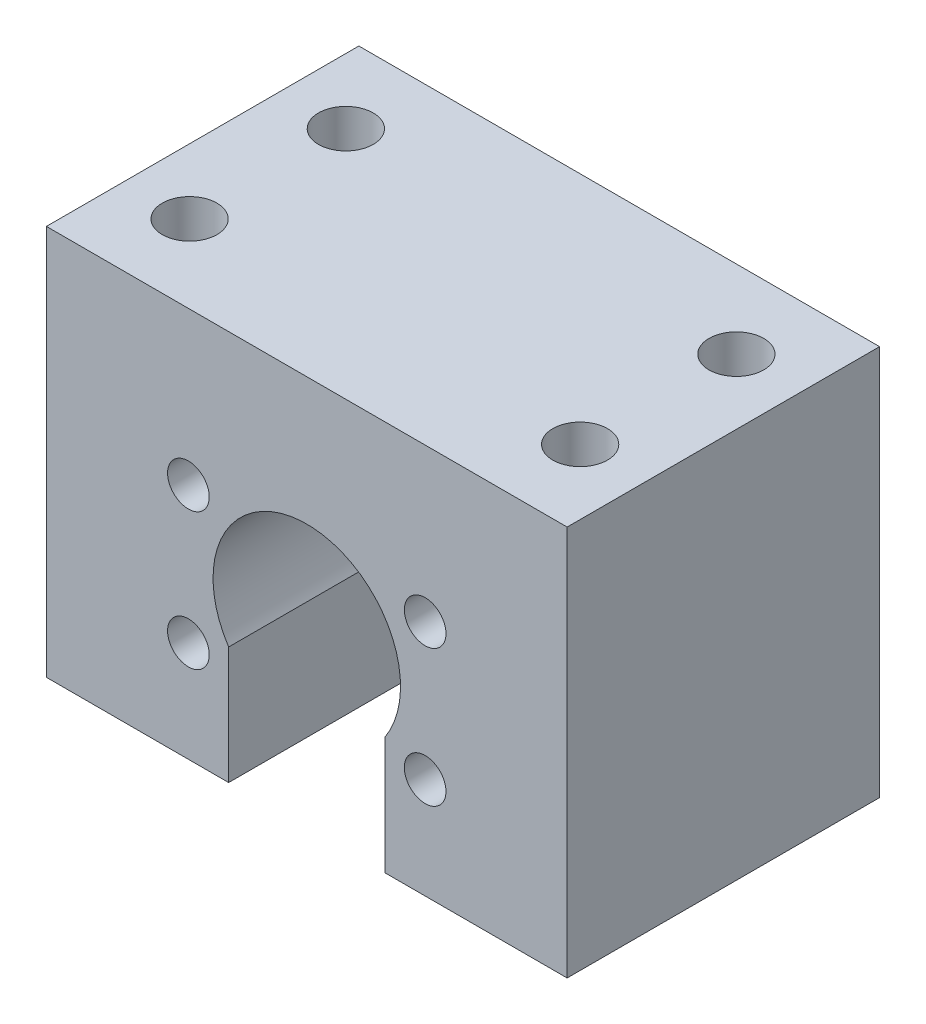
ISO-10303-21;
HEADER;
FILE_DESCRIPTION(('STEP AP214'),'2;1');
FILE_NAME('part.step','',(''),(''),'','','');
FILE_SCHEMA(('AUTOMOTIVE_DESIGN { 1 0 10303 214 1 1 1 1 }'));
ENDSEC;
DATA;
#1=APPLICATION_CONTEXT('core data for automotive mechanical design processes');
#2=APPLICATION_PROTOCOL_DEFINITION('international standard','automotive_design',2000,#1);
#3=PRODUCT_CONTEXT('',#1,'mechanical');
#4=PRODUCT('Part','Part','',(#3));
#5=PRODUCT_RELATED_PRODUCT_CATEGORY('part','',(#4));
#6=PRODUCT_DEFINITION_FORMATION('','',#4);
#7=PRODUCT_DEFINITION_CONTEXT('part definition',#1,'design');
#8=PRODUCT_DEFINITION('design','',#6,#7);
#9=PRODUCT_DEFINITION_SHAPE('','',#8);
#10=(LENGTH_UNIT() NAMED_UNIT(*) SI_UNIT(.MILLI.,.METRE.));
#11=(NAMED_UNIT(*) PLANE_ANGLE_UNIT() SI_UNIT($,.RADIAN.));
#12=(NAMED_UNIT(*) SI_UNIT($,.STERADIAN.) SOLID_ANGLE_UNIT());
#13=UNCERTAINTY_MEASURE_WITH_UNIT(LENGTH_MEASURE(1.E-05),#10,'distance_accuracy_value','');
#14=(GEOMETRIC_REPRESENTATION_CONTEXT(3) GLOBAL_UNCERTAINTY_ASSIGNED_CONTEXT((#13)) GLOBAL_UNIT_ASSIGNED_CONTEXT((#10,
#11,#12)) REPRESENTATION_CONTEXT('',''));
#15=CARTESIAN_POINT('',(0.,0.,0.));
#16=DIRECTION('',(0.,0.,1.));
#17=DIRECTION('',(1.,0.,0.));
#18=AXIS2_PLACEMENT_3D('',#15,#16,#17);
#19=CARTESIAN_POINT('',(0.,-30.,24.));
#20=DIRECTION('',(0.,1.,0.));
#21=DIRECTION('',(0.,0.,1.));
#22=AXIS2_PLACEMENT_3D('',#19,#20,#21);
#23=PLANE('',#22);
#24=CARTESIAN_POINT('',(5.,-30.,18.));
#25=DIRECTION('',(0.,1.,0.));
#26=DIRECTION('',(0.,0.,1.));
#27=AXIS2_PLACEMENT_3D('',#24,#25,#26);
#28=CIRCLE('',#27,2.1);
#29=CARTESIAN_POINT('',(5.,-30.,20.1));
#30=VERTEX_POINT('',#29);
#31=EDGE_CURVE('E250',#30,#30,#28,.T.);
#32=ORIENTED_EDGE('',*,*,#31,.T.);
#33=EDGE_LOOP('',(#32));
#34=FACE_BOUND('',#33,.T.);
#35=CARTESIAN_POINT('',(5.,-30.,6.));
#36=DIRECTION('',(0.,1.,0.));
#37=DIRECTION('',(0.,0.,1.));
#38=AXIS2_PLACEMENT_3D('',#35,#36,#37);
#39=CIRCLE('',#38,2.1);
#40=CARTESIAN_POINT('',(5.,-30.,8.1));
#41=VERTEX_POINT('',#40);
#42=EDGE_CURVE('E253',#41,#41,#39,.T.);
#43=ORIENTED_EDGE('',*,*,#42,.T.);
#44=EDGE_LOOP('',(#43));
#45=FACE_BOUND('',#44,.T.);
#46=DIRECTION('',(0.,0.,-1.));
#47=VECTOR('',#46,1.);
#48=CARTESIAN_POINT('',(14.,-30.,24.));
#49=LINE('',#48,#47);
#50=CARTESIAN_POINT('',(14.,-30.,24.));
#51=VERTEX_POINT('',#50);
#52=CARTESIAN_POINT('',(14.,-30.,0.));
#53=VERTEX_POINT('',#52);
#54=EDGE_CURVE('E58',#51,#53,#49,.T.);
#55=ORIENTED_EDGE('',*,*,#54,.F.);
#56=DIRECTION('',(1.,0.,0.));
#57=VECTOR('',#56,1.);
#58=CARTESIAN_POINT('',(0.,-30.,24.));
#59=LINE('',#58,#57);
#60=CARTESIAN_POINT('',(0.,-30.,24.));
#61=VERTEX_POINT('',#60);
#62=EDGE_CURVE('E94',#61,#51,#59,.T.);
#63=ORIENTED_EDGE('',*,*,#62,.F.);
#64=DIRECTION('',(0.,0.,-1.));
#65=VECTOR('',#64,1.);
#66=CARTESIAN_POINT('',(0.,-30.,24.));
#67=LINE('',#66,#65);
#68=CARTESIAN_POINT('',(0.,-30.,0.));
#69=VERTEX_POINT('',#68);
#70=EDGE_CURVE('E11',#61,#69,#67,.T.);
#71=ORIENTED_EDGE('',*,*,#70,.T.);
#72=DIRECTION('',(1.,0.,0.));
#73=VECTOR('',#72,1.);
#74=CARTESIAN_POINT('',(0.,-30.,0.));
#75=LINE('',#74,#73);
#76=EDGE_CURVE('E125',#69,#53,#75,.T.);
#77=ORIENTED_EDGE('',*,*,#76,.T.);
#78=EDGE_LOOP('',(#55,#63,#71,#77));
#79=FACE_BOUND('',#78,.T.);
#80=ADVANCED_FACE('F43',(#34,#45,#79),#23,.F.);
#81=CARTESIAN_POINT('',(0.,0.,24.));
#82=DIRECTION('',(0.,0.,1.));
#83=DIRECTION('',(1.,0.,0.));
#84=AXIS2_PLACEMENT_3D('',#81,#82,#83);
#85=PLANE('',#84);
#86=CARTESIAN_POINT('',(29.0932667397366,-22.25,24.));
#87=DIRECTION('',(0.,0.,-1.));
#88=DIRECTION('',(-1.,0.,0.));
#89=AXIS2_PLACEMENT_3D('',#86,#87,#88);
#90=CIRCLE('',#89,1.6);
#91=CARTESIAN_POINT('',(27.4932667397366,-22.25,24.));
#92=VERTEX_POINT('',#91);
#93=EDGE_CURVE('E230',#92,#92,#90,.T.);
#94=ORIENTED_EDGE('',*,*,#93,.T.);
#95=EDGE_LOOP('',(#94));
#96=FACE_BOUND('',#95,.T.);
#97=CARTESIAN_POINT('',(10.9067332602634,-22.25,24.));
#98=DIRECTION('',(0.,0.,-1.));
#99=DIRECTION('',(-1.,0.,0.));
#100=AXIS2_PLACEMENT_3D('',#97,#98,#99);
#101=CIRCLE('',#100,1.6);
#102=CARTESIAN_POINT('',(9.3067332602634,-22.25,24.));
#103=VERTEX_POINT('',#102);
#104=EDGE_CURVE('E239',#103,#103,#101,.F.);
#105=ORIENTED_EDGE('',*,*,#104,.F.);
#106=EDGE_LOOP('',(#105));
#107=FACE_BOUND('',#106,.T.);
#108=CARTESIAN_POINT('',(10.9067332602634,-11.75,24.));
#109=DIRECTION('',(0.,0.,-1.));
#110=DIRECTION('',(-1.,0.,0.));
#111=AXIS2_PLACEMENT_3D('',#108,#109,#110);
#112=CIRCLE('',#111,1.6);
#113=CARTESIAN_POINT('',(9.3067332602634,-11.75,24.));
#114=VERTEX_POINT('',#113);
#115=EDGE_CURVE('E147',#114,#114,#112,.T.);
#116=ORIENTED_EDGE('',*,*,#115,.T.);
#117=EDGE_LOOP('',(#116));
#118=FACE_BOUND('',#117,.T.);
#119=DIRECTION('',(0.,-1.,0.));
#120=VECTOR('',#119,1.);
#121=CARTESIAN_POINT('',(26.,0.,24.));
#122=LINE('',#121,#120);
#123=CARTESIAN_POINT('',(26.,-20.9799497484265,24.));
#124=VERTEX_POINT('',#123);
#125=CARTESIAN_POINT('',(26.,-30.,24.));
#126=VERTEX_POINT('',#125);
#127=EDGE_CURVE('E126',#124,#126,#122,.T.);
#128=ORIENTED_EDGE('',*,*,#127,.T.);
#129=CARTESIAN_POINT('',(40.,-30.,24.));
#130=VERTEX_POINT('',#129);
#131=EDGE_CURVE('E135',#126,#130,#59,.T.);
#132=ORIENTED_EDGE('',*,*,#131,.T.);
#133=DIRECTION('',(0.,1.,0.));
#134=VECTOR('',#133,1.);
#135=CARTESIAN_POINT('',(40.,0.,24.));
#136=LINE('',#135,#134);
#137=CARTESIAN_POINT('',(40.,0.,24.));
#138=VERTEX_POINT('',#137);
#139=EDGE_CURVE('E134',#130,#138,#136,.T.);
#140=ORIENTED_EDGE('',*,*,#139,.T.);
#141=DIRECTION('',(-1.,0.,0.));
#142=VECTOR('',#141,1.);
#143=CARTESIAN_POINT('',(0.,0.,24.));
#144=LINE('',#143,#142);
#145=CARTESIAN_POINT('',(0.,0.,24.));
#146=VERTEX_POINT('',#145);
#147=EDGE_CURVE('E67',#138,#146,#144,.T.);
#148=ORIENTED_EDGE('',*,*,#147,.T.);
#149=DIRECTION('',(0.,-1.,0.));
#150=VECTOR('',#149,1.);
#151=CARTESIAN_POINT('',(0.,0.,24.));
#152=LINE('',#151,#150);
#153=EDGE_CURVE('E132',#146,#61,#152,.T.);
#154=ORIENTED_EDGE('',*,*,#153,.T.);
#155=ORIENTED_EDGE('',*,*,#62,.T.);
#156=DIRECTION('',(0.,-1.,0.));
#157=VECTOR('',#156,1.);
#158=CARTESIAN_POINT('',(14.,0.,24.));
#159=LINE('',#158,#157);
#160=CARTESIAN_POINT('',(14.,-20.9799497484265,24.));
#161=VERTEX_POINT('',#160);
#162=EDGE_CURVE('E116',#161,#51,#159,.T.);
#163=ORIENTED_EDGE('',*,*,#162,.F.);
#164=CARTESIAN_POINT('',(20.,-17.,24.));
#165=DIRECTION('',(0.,0.,-1.));
#166=DIRECTION('',(-1.,0.,0.));
#167=AXIS2_PLACEMENT_3D('',#164,#165,#166);
#168=CIRCLE('',#167,7.2);
#169=EDGE_CURVE('E121',#161,#124,#168,.T.);
#170=ORIENTED_EDGE('',*,*,#169,.T.);
#171=EDGE_LOOP('',(#128,#132,#140,#148,#154,#155,#163,#170));
#172=FACE_BOUND('',#171,.T.);
#173=CARTESIAN_POINT('',(29.0932667397366,-11.75,24.));
#174=DIRECTION('',(0.,0.,-1.));
#175=DIRECTION('',(-1.,0.,0.));
#176=AXIS2_PLACEMENT_3D('',#173,#174,#175);
#177=CIRCLE('',#176,1.6);
#178=CARTESIAN_POINT('',(27.4932667397366,-11.75,24.));
#179=VERTEX_POINT('',#178);
#180=EDGE_CURVE('E216',#179,#179,#177,.F.);
#181=ORIENTED_EDGE('',*,*,#180,.F.);
#182=EDGE_LOOP('',(#181));
#183=FACE_BOUND('',#182,.T.);
#184=ADVANCED_FACE('F129',(#96,#107,#118,#172,#183),#85,.T.);
#185=CARTESIAN_POINT('',(0.,0.,0.));
#186=DIRECTION('',(0.,0.,1.));
#187=DIRECTION('',(1.,0.,0.));
#188=AXIS2_PLACEMENT_3D('',#185,#186,#187);
#189=PLANE('',#188);
#190=CARTESIAN_POINT('',(29.0932667397366,-22.25,0.));
#191=DIRECTION('',(0.,0.,-1.));
#192=DIRECTION('',(-1.,0.,0.));
#193=AXIS2_PLACEMENT_3D('',#190,#191,#192);
#194=CIRCLE('',#193,1.6);
#195=CARTESIAN_POINT('',(27.4932667397366,-22.25,0.));
#196=VERTEX_POINT('',#195);
#197=EDGE_CURVE('E233',#196,#196,#194,.T.);
#198=ORIENTED_EDGE('',*,*,#197,.F.);
#199=EDGE_LOOP('',(#198));
#200=FACE_BOUND('',#199,.T.);
#201=CARTESIAN_POINT('',(10.9067332602634,-11.75,0.));
#202=DIRECTION('',(0.,0.,-1.));
#203=DIRECTION('',(-1.,0.,0.));
#204=AXIS2_PLACEMENT_3D('',#201,#202,#203);
#205=CIRCLE('',#204,1.6);
#206=CARTESIAN_POINT('',(9.3067332602634,-11.75,0.));
#207=VERTEX_POINT('',#206);
#208=EDGE_CURVE('E237',#207,#207,#205,.T.);
#209=ORIENTED_EDGE('',*,*,#208,.F.);
#210=EDGE_LOOP('',(#209));
#211=FACE_BOUND('',#210,.T.);
#212=CARTESIAN_POINT('',(26.,-30.,0.));
#213=VERTEX_POINT('',#212);
#214=CARTESIAN_POINT('',(40.,-30.,0.));
#215=VERTEX_POINT('',#214);
#216=EDGE_CURVE('E146',#213,#215,#75,.T.);
#217=ORIENTED_EDGE('',*,*,#216,.F.);
#218=DIRECTION('',(0.,-1.,0.));
#219=VECTOR('',#218,1.);
#220=CARTESIAN_POINT('',(26.,0.,0.));
#221=LINE('',#220,#219);
#222=CARTESIAN_POINT('',(26.,-20.9799497484265,0.));
#223=VERTEX_POINT('',#222);
#224=EDGE_CURVE('E122',#223,#213,#221,.T.);
#225=ORIENTED_EDGE('',*,*,#224,.F.);
#226=CARTESIAN_POINT('',(20.,-17.,0.));
#227=DIRECTION('',(0.,0.,-1.));
#228=DIRECTION('',(-1.,0.,0.));
#229=AXIS2_PLACEMENT_3D('',#226,#227,#228);
#230=CIRCLE('',#229,7.2);
#231=CARTESIAN_POINT('',(14.,-20.9799497484265,0.));
#232=VERTEX_POINT('',#231);
#233=EDGE_CURVE('E215',#232,#223,#230,.T.);
#234=ORIENTED_EDGE('',*,*,#233,.F.);
#235=DIRECTION('',(0.,-1.,0.));
#236=VECTOR('',#235,1.);
#237=CARTESIAN_POINT('',(14.,0.,0.));
#238=LINE('',#237,#236);
#239=EDGE_CURVE('E213',#232,#53,#238,.T.);
#240=ORIENTED_EDGE('',*,*,#239,.T.);
#241=ORIENTED_EDGE('',*,*,#76,.F.);
#242=DIRECTION('',(0.,-1.,0.));
#243=VECTOR('',#242,1.);
#244=CARTESIAN_POINT('',(0.,0.,0.));
#245=LINE('',#244,#243);
#246=CARTESIAN_POINT('',(0.,0.,0.));
#247=VERTEX_POINT('',#246);
#248=EDGE_CURVE('E143',#247,#69,#245,.T.);
#249=ORIENTED_EDGE('',*,*,#248,.F.);
#250=DIRECTION('',(-1.,0.,0.));
#251=VECTOR('',#250,1.);
#252=CARTESIAN_POINT('',(0.,0.,0.));
#253=LINE('',#252,#251);
#254=CARTESIAN_POINT('',(40.,0.,0.));
#255=VERTEX_POINT('',#254);
#256=EDGE_CURVE('E88',#255,#247,#253,.T.);
#257=ORIENTED_EDGE('',*,*,#256,.F.);
#258=DIRECTION('',(0.,1.,0.));
#259=VECTOR('',#258,1.);
#260=CARTESIAN_POINT('',(40.,0.,0.));
#261=LINE('',#260,#259);
#262=EDGE_CURVE('E149',#215,#255,#261,.T.);
#263=ORIENTED_EDGE('',*,*,#262,.F.);
#264=EDGE_LOOP('',(#217,#225,#234,#240,#241,#249,#257,#263));
#265=FACE_BOUND('',#264,.T.);
#266=CARTESIAN_POINT('',(10.9067332602634,-22.25,0.));
#267=DIRECTION('',(0.,0.,-1.));
#268=DIRECTION('',(-1.,0.,0.));
#269=AXIS2_PLACEMENT_3D('',#266,#267,#268);
#270=CIRCLE('',#269,1.6);
#271=CARTESIAN_POINT('',(9.3067332602634,-22.25,0.));
#272=VERTEX_POINT('',#271);
#273=EDGE_CURVE('E221',#272,#272,#270,.F.);
#274=ORIENTED_EDGE('',*,*,#273,.T.);
#275=EDGE_LOOP('',(#274));
#276=FACE_BOUND('',#275,.T.);
#277=CARTESIAN_POINT('',(29.0932667397366,-11.75,0.));
#278=DIRECTION('',(0.,0.,-1.));
#279=DIRECTION('',(-1.,0.,0.));
#280=AXIS2_PLACEMENT_3D('',#277,#278,#279);
#281=CIRCLE('',#280,1.6);
#282=CARTESIAN_POINT('',(27.4932667397366,-11.75,0.));
#283=VERTEX_POINT('',#282);
#284=EDGE_CURVE('E227',#283,#283,#281,.F.);
#285=ORIENTED_EDGE('',*,*,#284,.T.);
#286=EDGE_LOOP('',(#285));
#287=FACE_BOUND('',#286,.T.);
#288=ADVANCED_FACE('F165',(#200,#211,#265,#276,#287),#189,.F.);
#289=CARTESIAN_POINT('',(0.,0.,24.));
#290=DIRECTION('',(1.,0.,0.));
#291=DIRECTION('',(0.,1.,0.));
#292=AXIS2_PLACEMENT_3D('',#289,#290,#291);
#293=PLANE('',#292);
#294=ORIENTED_EDGE('',*,*,#248,.T.);
#295=ORIENTED_EDGE('',*,*,#70,.F.);
#296=ORIENTED_EDGE('',*,*,#153,.F.);
#297=DIRECTION('',(0.,0.,-1.));
#298=VECTOR('',#297,1.);
#299=CARTESIAN_POINT('',(0.,0.,24.));
#300=LINE('',#299,#298);
#301=EDGE_CURVE('E142',#146,#247,#300,.T.);
#302=ORIENTED_EDGE('',*,*,#301,.T.);
#303=EDGE_LOOP('',(#294,#295,#296,#302));
#304=FACE_BOUND('',#303,.T.);
#305=ADVANCED_FACE('F45',(#304),#293,.F.);
#306=CARTESIAN_POINT('',(35.,-30.,6.));
#307=DIRECTION('',(0.,1.,0.));
#308=DIRECTION('',(0.,0.,1.));
#309=AXIS2_PLACEMENT_3D('',#306,#307,#308);
#310=CIRCLE('',#309,2.1);
#311=CARTESIAN_POINT('',(35.,-30.,8.09999999999999));
#312=VERTEX_POINT('',#311);
#313=EDGE_CURVE('E202',#312,#312,#310,.T.);
#314=ORIENTED_EDGE('',*,*,#313,.T.);
#315=EDGE_LOOP('',(#314));
#316=FACE_BOUND('',#315,.T.);
#317=CARTESIAN_POINT('',(35.,-30.,18.));
#318=DIRECTION('',(0.,1.,0.));
#319=DIRECTION('',(0.,0.,1.));
#320=AXIS2_PLACEMENT_3D('',#317,#318,#319);
#321=CIRCLE('',#320,2.1);
#322=CARTESIAN_POINT('',(35.,-30.,20.1));
#323=VERTEX_POINT('',#322);
#324=EDGE_CURVE('E205',#323,#323,#321,.T.);
#325=ORIENTED_EDGE('',*,*,#324,.T.);
#326=EDGE_LOOP('',(#325));
#327=FACE_BOUND('',#326,.T.);
#328=ORIENTED_EDGE('',*,*,#131,.F.);
#329=DIRECTION('',(0.,0.,-1.));
#330=VECTOR('',#329,1.);
#331=CARTESIAN_POINT('',(26.,-30.,24.));
#332=LINE('',#331,#330);
#333=EDGE_CURVE('E207',#126,#213,#332,.T.);
#334=ORIENTED_EDGE('',*,*,#333,.T.);
#335=ORIENTED_EDGE('',*,*,#216,.T.);
#336=DIRECTION('',(0.,0.,-1.));
#337=VECTOR('',#336,1.);
#338=CARTESIAN_POINT('',(40.,-30.,24.));
#339=LINE('',#338,#337);
#340=EDGE_CURVE('E51',#130,#215,#339,.T.);
#341=ORIENTED_EDGE('',*,*,#340,.F.);
#342=EDGE_LOOP('',(#328,#334,#335,#341));
#343=FACE_BOUND('',#342,.T.);
#344=ADVANCED_FACE('F182',(#316,#327,#343),#23,.F.);
#345=CARTESIAN_POINT('',(40.,0.,24.));
#346=DIRECTION('',(-1.,0.,0.));
#347=DIRECTION('',(0.,-1.,0.));
#348=AXIS2_PLACEMENT_3D('',#345,#346,#347);
#349=PLANE('',#348);
#350=ORIENTED_EDGE('',*,*,#262,.T.);
#351=DIRECTION('',(0.,0.,-1.));
#352=VECTOR('',#351,1.);
#353=CARTESIAN_POINT('',(40.,0.,24.));
#354=LINE('',#353,#352);
#355=EDGE_CURVE('E153',#138,#255,#354,.T.);
#356=ORIENTED_EDGE('',*,*,#355,.F.);
#357=ORIENTED_EDGE('',*,*,#139,.F.);
#358=ORIENTED_EDGE('',*,*,#340,.T.);
#359=EDGE_LOOP('',(#350,#356,#357,#358));
#360=FACE_BOUND('',#359,.T.);
#361=ADVANCED_FACE('F159',(#360),#349,.F.);
#362=CARTESIAN_POINT('',(0.,0.,24.));
#363=DIRECTION('',(0.,-1.,0.));
#364=DIRECTION('',(0.,0.,-1.));
#365=AXIS2_PLACEMENT_3D('',#362,#363,#364);
#366=PLANE('',#365);
#367=CARTESIAN_POINT('',(35.,0.,6.));
#368=DIRECTION('',(0.,1.,0.));
#369=DIRECTION('',(0.,0.,-1.));
#370=AXIS2_PLACEMENT_3D('',#367,#368,#369);
#371=CIRCLE('',#370,2.1);
#372=CARTESIAN_POINT('',(35.,0.,3.9));
#373=VERTEX_POINT('',#372);
#374=EDGE_CURVE('E259',#373,#373,#371,.T.);
#375=ORIENTED_EDGE('',*,*,#374,.F.);
#376=EDGE_LOOP('',(#375));
#377=FACE_BOUND('',#376,.T.);
#378=CARTESIAN_POINT('',(5.,0.,18.));
#379=DIRECTION('',(0.,1.,0.));
#380=DIRECTION('',(0.,0.,-1.));
#381=AXIS2_PLACEMENT_3D('',#378,#379,#380);
#382=CIRCLE('',#381,2.1);
#383=CARTESIAN_POINT('',(5.,0.,15.9));
#384=VERTEX_POINT('',#383);
#385=EDGE_CURVE('E260',#384,#384,#382,.T.);
#386=ORIENTED_EDGE('',*,*,#385,.F.);
#387=EDGE_LOOP('',(#386));
#388=FACE_BOUND('',#387,.T.);
#389=CARTESIAN_POINT('',(35.,0.,18.));
#390=DIRECTION('',(0.,1.,0.));
#391=DIRECTION('',(0.,0.,1.));
#392=AXIS2_PLACEMENT_3D('',#389,#390,#391);
#393=CIRCLE('',#392,2.1);
#394=CARTESIAN_POINT('',(35.,0.,20.1));
#395=VERTEX_POINT('',#394);
#396=EDGE_CURVE('E263',#395,#395,#393,.T.);
#397=ORIENTED_EDGE('',*,*,#396,.F.);
#398=EDGE_LOOP('',(#397));
#399=FACE_BOUND('',#398,.T.);
#400=CARTESIAN_POINT('',(5.,0.,6.));
#401=DIRECTION('',(0.,1.,0.));
#402=DIRECTION('',(0.,0.,1.));
#403=AXIS2_PLACEMENT_3D('',#400,#401,#402);
#404=CIRCLE('',#403,2.1);
#405=CARTESIAN_POINT('',(5.,0.,8.1));
#406=VERTEX_POINT('',#405);
#407=EDGE_CURVE('E256',#406,#406,#404,.T.);
#408=ORIENTED_EDGE('',*,*,#407,.F.);
#409=EDGE_LOOP('',(#408));
#410=FACE_BOUND('',#409,.T.);
#411=ORIENTED_EDGE('',*,*,#256,.T.);
#412=ORIENTED_EDGE('',*,*,#301,.F.);
#413=ORIENTED_EDGE('',*,*,#147,.F.);
#414=ORIENTED_EDGE('',*,*,#355,.T.);
#415=EDGE_LOOP('',(#411,#412,#413,#414));
#416=FACE_BOUND('',#415,.T.);
#417=ADVANCED_FACE('F170',(#377,#388,#399,#410,#416),#366,.F.);
#418=CARTESIAN_POINT('',(10.9067332602634,-11.75,24.));
#419=DIRECTION('',(0.,0.,-1.));
#420=DIRECTION('',(-1.,0.,0.));
#421=AXIS2_PLACEMENT_3D('',#418,#419,#420);
#422=CYLINDRICAL_SURFACE('',#421,1.6);
#423=ORIENTED_EDGE('',*,*,#115,.F.);
#424=EDGE_LOOP('',(#423));
#425=FACE_BOUND('',#424,.T.);
#426=ORIENTED_EDGE('',*,*,#208,.T.);
#427=EDGE_LOOP('',(#426));
#428=FACE_BOUND('',#427,.T.);
#429=ADVANCED_FACE('F172',(#425,#428),#422,.F.);
#430=CARTESIAN_POINT('',(10.9067332602634,-22.25,24.));
#431=DIRECTION('',(0.,0.,-1.));
#432=DIRECTION('',(-1.,0.,0.));
#433=AXIS2_PLACEMENT_3D('',#430,#431,#432);
#434=CYLINDRICAL_SURFACE('',#433,1.6);
#435=ORIENTED_EDGE('',*,*,#104,.T.);
#436=EDGE_LOOP('',(#435));
#437=FACE_BOUND('',#436,.T.);
#438=ORIENTED_EDGE('',*,*,#273,.F.);
#439=EDGE_LOOP('',(#438));
#440=FACE_BOUND('',#439,.T.);
#441=ADVANCED_FACE('F179',(#437,#440),#434,.F.);
#442=CARTESIAN_POINT('',(26.,0.,24.));
#443=DIRECTION('',(1.,0.,0.));
#444=DIRECTION('',(0.,1.,0.));
#445=AXIS2_PLACEMENT_3D('',#442,#443,#444);
#446=PLANE('',#445);
#447=ORIENTED_EDGE('',*,*,#224,.T.);
#448=ORIENTED_EDGE('',*,*,#333,.F.);
#449=ORIENTED_EDGE('',*,*,#127,.F.);
#450=DIRECTION('',(0.,0.,-1.));
#451=VECTOR('',#450,1.);
#452=CARTESIAN_POINT('',(26.,-20.9799497484265,24.));
#453=LINE('',#452,#451);
#454=EDGE_CURVE('E222',#124,#223,#453,.T.);
#455=ORIENTED_EDGE('',*,*,#454,.T.);
#456=EDGE_LOOP('',(#447,#448,#449,#455));
#457=FACE_BOUND('',#456,.T.);
#458=ADVANCED_FACE('F295',(#457),#446,.F.);
#459=CARTESIAN_POINT('',(20.,-17.,24.));
#460=DIRECTION('',(0.,0.,-1.));
#461=DIRECTION('',(-1.,0.,0.));
#462=AXIS2_PLACEMENT_3D('',#459,#460,#461);
#463=CYLINDRICAL_SURFACE('',#462,7.2);
#464=ORIENTED_EDGE('',*,*,#233,.T.);
#465=ORIENTED_EDGE('',*,*,#454,.F.);
#466=ORIENTED_EDGE('',*,*,#169,.F.);
#467=DIRECTION('',(0.,0.,-1.));
#468=VECTOR('',#467,1.);
#469=CARTESIAN_POINT('',(14.,-20.9799497484265,24.));
#470=LINE('',#469,#468);
#471=EDGE_CURVE('E118',#161,#232,#470,.T.);
#472=ORIENTED_EDGE('',*,*,#471,.T.);
#473=EDGE_LOOP('',(#464,#465,#466,#472));
#474=FACE_BOUND('',#473,.T.);
#475=ADVANCED_FACE('F298',(#474),#463,.F.);
#476=CARTESIAN_POINT('',(14.,0.,24.));
#477=DIRECTION('',(1.,0.,0.));
#478=DIRECTION('',(0.,1.,0.));
#479=AXIS2_PLACEMENT_3D('',#476,#477,#478);
#480=PLANE('',#479);
#481=ORIENTED_EDGE('',*,*,#239,.F.);
#482=ORIENTED_EDGE('',*,*,#471,.F.);
#483=ORIENTED_EDGE('',*,*,#162,.T.);
#484=ORIENTED_EDGE('',*,*,#54,.T.);
#485=EDGE_LOOP('',(#481,#482,#483,#484));
#486=FACE_BOUND('',#485,.T.);
#487=ADVANCED_FACE('F117',(#486),#480,.T.);
#488=CARTESIAN_POINT('',(29.0932667397366,-11.75,24.));
#489=DIRECTION('',(0.,0.,-1.));
#490=DIRECTION('',(-1.,0.,0.));
#491=AXIS2_PLACEMENT_3D('',#488,#489,#490);
#492=CYLINDRICAL_SURFACE('',#491,1.6);
#493=ORIENTED_EDGE('',*,*,#180,.T.);
#494=EDGE_LOOP('',(#493));
#495=FACE_BOUND('',#494,.T.);
#496=ORIENTED_EDGE('',*,*,#284,.F.);
#497=EDGE_LOOP('',(#496));
#498=FACE_BOUND('',#497,.T.);
#499=ADVANCED_FACE('F287',(#495,#498),#492,.F.);
#500=CARTESIAN_POINT('',(29.0932667397366,-22.25,24.));
#501=DIRECTION('',(0.,0.,-1.));
#502=DIRECTION('',(-1.,0.,0.));
#503=AXIS2_PLACEMENT_3D('',#500,#501,#502);
#504=CYLINDRICAL_SURFACE('',#503,1.6);
#505=ORIENTED_EDGE('',*,*,#93,.F.);
#506=EDGE_LOOP('',(#505));
#507=FACE_BOUND('',#506,.T.);
#508=ORIENTED_EDGE('',*,*,#197,.T.);
#509=EDGE_LOOP('',(#508));
#510=FACE_BOUND('',#509,.T.);
#511=ADVANCED_FACE('F278',(#507,#510),#504,.F.);
#512=CARTESIAN_POINT('',(5.,-34.,6.));
#513=DIRECTION('',(0.,1.,0.));
#514=DIRECTION('',(0.,0.,1.));
#515=AXIS2_PLACEMENT_3D('',#512,#513,#514);
#516=CYLINDRICAL_SURFACE('',#515,2.1);
#517=ORIENTED_EDGE('',*,*,#407,.T.);
#518=EDGE_LOOP('',(#517));
#519=FACE_BOUND('',#518,.T.);
#520=ORIENTED_EDGE('',*,*,#42,.F.);
#521=EDGE_LOOP('',(#520));
#522=FACE_BOUND('',#521,.T.);
#523=ADVANCED_FACE('F275',(#519,#522),#516,.F.);
#524=CARTESIAN_POINT('',(35.,-34.,18.));
#525=DIRECTION('',(0.,1.,0.));
#526=DIRECTION('',(0.,0.,1.));
#527=AXIS2_PLACEMENT_3D('',#524,#525,#526);
#528=CYLINDRICAL_SURFACE('',#527,2.1);
#529=ORIENTED_EDGE('',*,*,#396,.T.);
#530=EDGE_LOOP('',(#529));
#531=FACE_BOUND('',#530,.T.);
#532=ORIENTED_EDGE('',*,*,#324,.F.);
#533=EDGE_LOOP('',(#532));
#534=FACE_BOUND('',#533,.T.);
#535=ADVANCED_FACE('F269',(#531,#534),#528,.F.);
#536=CARTESIAN_POINT('',(5.,-34.,18.));
#537=DIRECTION('',(0.,1.,0.));
#538=DIRECTION('',(0.,0.,1.));
#539=AXIS2_PLACEMENT_3D('',#536,#537,#538);
#540=CYLINDRICAL_SURFACE('',#539,2.1);
#541=ORIENTED_EDGE('',*,*,#385,.T.);
#542=EDGE_LOOP('',(#541));
#543=FACE_BOUND('',#542,.T.);
#544=ORIENTED_EDGE('',*,*,#31,.F.);
#545=EDGE_LOOP('',(#544));
#546=FACE_BOUND('',#545,.T.);
#547=ADVANCED_FACE('F284',(#543,#546),#540,.F.);
#548=CARTESIAN_POINT('',(35.,-34.,6.));
#549=DIRECTION('',(0.,1.,0.));
#550=DIRECTION('',(0.,0.,1.));
#551=AXIS2_PLACEMENT_3D('',#548,#549,#550);
#552=CYLINDRICAL_SURFACE('',#551,2.1);
#553=ORIENTED_EDGE('',*,*,#374,.T.);
#554=EDGE_LOOP('',(#553));
#555=FACE_BOUND('',#554,.T.);
#556=ORIENTED_EDGE('',*,*,#313,.F.);
#557=EDGE_LOOP('',(#556));
#558=FACE_BOUND('',#557,.T.);
#559=ADVANCED_FACE('F404',(#555,#558),#552,.F.);
#560=CLOSED_SHELL('',(#80,#184,#288,#305,#344,#361,#417,#429,#441,#458,#475,#487,#499,#511,#523,
#535,#547,#559));
#561=MANIFOLD_SOLID_BREP('B2',#560);
#562=ADVANCED_BREP_SHAPE_REPRESENTATION('',(#18,#561),#14);
#563=SHAPE_DEFINITION_REPRESENTATION(#9,#562);
ENDSEC;
END-ISO-10303-21;
